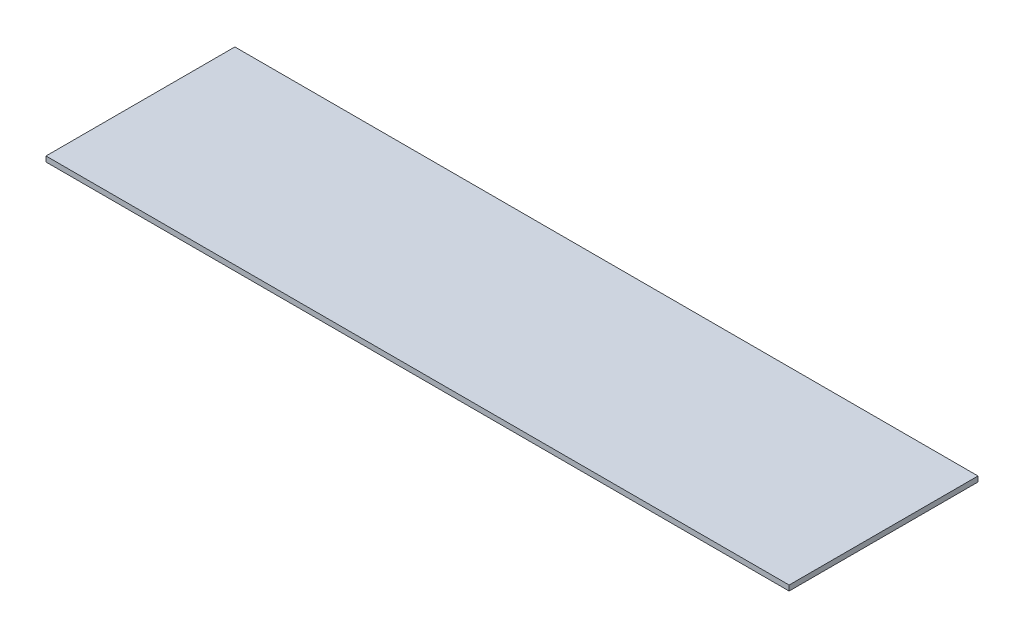
ISO-10303-21;
HEADER;
FILE_DESCRIPTION(('STEP AP214'),'2;1');
FILE_NAME('part.step','',(''),(''),'','','');
FILE_SCHEMA(('AUTOMOTIVE_DESIGN { 1 0 10303 214 1 1 1 1 }'));
ENDSEC;
DATA;
#1=APPLICATION_CONTEXT('core data for automotive mechanical design processes');
#2=APPLICATION_PROTOCOL_DEFINITION('international standard','automotive_design',2000,#1);
#3=PRODUCT_CONTEXT('',#1,'mechanical');
#4=PRODUCT('Part','Part','',(#3));
#5=PRODUCT_RELATED_PRODUCT_CATEGORY('part','',(#4));
#6=PRODUCT_DEFINITION_FORMATION('','',#4);
#7=PRODUCT_DEFINITION_CONTEXT('part definition',#1,'design');
#8=PRODUCT_DEFINITION('design','',#6,#7);
#9=PRODUCT_DEFINITION_SHAPE('','',#8);
#10=(LENGTH_UNIT() NAMED_UNIT(*) SI_UNIT(.MILLI.,.METRE.));
#11=(NAMED_UNIT(*) PLANE_ANGLE_UNIT() SI_UNIT($,.RADIAN.));
#12=(NAMED_UNIT(*) SI_UNIT($,.STERADIAN.) SOLID_ANGLE_UNIT());
#13=UNCERTAINTY_MEASURE_WITH_UNIT(LENGTH_MEASURE(1.E-05),#10,'distance_accuracy_value','');
#14=(GEOMETRIC_REPRESENTATION_CONTEXT(3) GLOBAL_UNCERTAINTY_ASSIGNED_CONTEXT((#13)) GLOBAL_UNIT_ASSIGNED_CONTEXT((#10,
#11,#12)) REPRESENTATION_CONTEXT('',''));
#15=CARTESIAN_POINT('',(0.,0.,0.));
#16=DIRECTION('',(0.,0.,1.));
#17=DIRECTION('',(1.,0.,0.));
#18=AXIS2_PLACEMENT_3D('',#15,#16,#17);
#19=CARTESIAN_POINT('',(-162.5,2.3,41.3));
#20=DIRECTION('',(1.,0.,0.));
#21=DIRECTION('',(0.,0.,-1.));
#22=AXIS2_PLACEMENT_3D('',#19,#20,#21);
#23=PLANE('',#22);
#24=DIRECTION('',(0.,0.,1.));
#25=VECTOR('',#24,1.);
#26=CARTESIAN_POINT('',(-162.5,0.,41.3));
#27=LINE('',#26,#25);
#28=CARTESIAN_POINT('',(-162.5,0.,-41.3));
#29=VERTEX_POINT('',#28);
#30=CARTESIAN_POINT('',(-162.5,0.,41.3));
#31=VERTEX_POINT('',#30);
#32=EDGE_CURVE('E97',#29,#31,#27,.T.);
#33=ORIENTED_EDGE('',*,*,#32,.T.);
#34=DIRECTION('',(0.,-1.,0.));
#35=VECTOR('',#34,1.);
#36=CARTESIAN_POINT('',(-162.5,2.3,41.3));
#37=LINE('',#36,#35);
#38=CARTESIAN_POINT('',(-162.5,2.3,41.3));
#39=VERTEX_POINT('',#38);
#40=EDGE_CURVE('E11',#39,#31,#37,.T.);
#41=ORIENTED_EDGE('',*,*,#40,.F.);
#42=DIRECTION('',(0.,0.,1.));
#43=VECTOR('',#42,1.);
#44=CARTESIAN_POINT('',(-162.5,2.3,41.3));
#45=LINE('',#44,#43);
#46=CARTESIAN_POINT('',(-162.5,2.3,-41.3));
#47=VERTEX_POINT('',#46);
#48=EDGE_CURVE('E85',#47,#39,#45,.T.);
#49=ORIENTED_EDGE('',*,*,#48,.F.);
#50=DIRECTION('',(0.,-1.,0.));
#51=VECTOR('',#50,1.);
#52=CARTESIAN_POINT('',(-162.5,2.3,-41.3));
#53=LINE('',#52,#51);
#54=EDGE_CURVE('E93',#47,#29,#53,.T.);
#55=ORIENTED_EDGE('',*,*,#54,.T.);
#56=EDGE_LOOP('',(#33,#41,#49,#55));
#57=FACE_BOUND('',#56,.T.);
#58=ADVANCED_FACE('F34',(#57),#23,.F.);
#59=CARTESIAN_POINT('',(162.5,2.3,41.3));
#60=DIRECTION('',(0.,0.,-1.));
#61=DIRECTION('',(-1.,0.,0.));
#62=AXIS2_PLACEMENT_3D('',#59,#60,#61);
#63=PLANE('',#62);
#64=DIRECTION('',(1.,0.,0.));
#65=VECTOR('',#64,1.);
#66=CARTESIAN_POINT('',(162.5,0.,41.3));
#67=LINE('',#66,#65);
#68=CARTESIAN_POINT('',(162.5,0.,41.3));
#69=VERTEX_POINT('',#68);
#70=EDGE_CURVE('E89',#31,#69,#67,.T.);
#71=ORIENTED_EDGE('',*,*,#70,.T.);
#72=DIRECTION('',(0.,-1.,0.));
#73=VECTOR('',#72,1.);
#74=CARTESIAN_POINT('',(162.5,2.3,41.3));
#75=LINE('',#74,#73);
#76=CARTESIAN_POINT('',(162.5,2.3,41.3));
#77=VERTEX_POINT('',#76);
#78=EDGE_CURVE('E42',#77,#69,#75,.T.);
#79=ORIENTED_EDGE('',*,*,#78,.F.);
#80=DIRECTION('',(1.,0.,0.));
#81=VECTOR('',#80,1.);
#82=CARTESIAN_POINT('',(162.5,2.3,41.3));
#83=LINE('',#82,#81);
#84=EDGE_CURVE('E80',#39,#77,#83,.T.);
#85=ORIENTED_EDGE('',*,*,#84,.F.);
#86=ORIENTED_EDGE('',*,*,#40,.T.);
#87=EDGE_LOOP('',(#71,#79,#85,#86));
#88=FACE_BOUND('',#87,.T.);
#89=ADVANCED_FACE('F88',(#88),#63,.F.);
#90=CARTESIAN_POINT('',(162.5,2.3,41.3));
#91=DIRECTION('',(-1.,0.,0.));
#92=DIRECTION('',(0.,0.,1.));
#93=AXIS2_PLACEMENT_3D('',#90,#91,#92);
#94=PLANE('',#93);
#95=DIRECTION('',(0.,0.,-1.));
#96=VECTOR('',#95,1.);
#97=CARTESIAN_POINT('',(162.5,0.,41.3));
#98=LINE('',#97,#96);
#99=CARTESIAN_POINT('',(162.5,0.,-41.3));
#100=VERTEX_POINT('',#99);
#101=EDGE_CURVE('E67',#69,#100,#98,.T.);
#102=ORIENTED_EDGE('',*,*,#101,.T.);
#103=DIRECTION('',(0.,-1.,0.));
#104=VECTOR('',#103,1.);
#105=CARTESIAN_POINT('',(162.5,2.3,-41.3));
#106=LINE('',#105,#104);
#107=CARTESIAN_POINT('',(162.5,2.3,-41.3));
#108=VERTEX_POINT('',#107);
#109=EDGE_CURVE('E90',#108,#100,#106,.T.);
#110=ORIENTED_EDGE('',*,*,#109,.F.);
#111=DIRECTION('',(0.,0.,-1.));
#112=VECTOR('',#111,1.);
#113=CARTESIAN_POINT('',(162.5,2.3,41.3));
#114=LINE('',#113,#112);
#115=EDGE_CURVE('E83',#77,#108,#114,.T.);
#116=ORIENTED_EDGE('',*,*,#115,.F.);
#117=ORIENTED_EDGE('',*,*,#78,.T.);
#118=EDGE_LOOP('',(#102,#110,#116,#117));
#119=FACE_BOUND('',#118,.T.);
#120=ADVANCED_FACE('F91',(#119),#94,.F.);
#121=CARTESIAN_POINT('',(162.5,2.3,-41.3));
#122=DIRECTION('',(0.,0.,1.));
#123=DIRECTION('',(1.,0.,0.));
#124=AXIS2_PLACEMENT_3D('',#121,#122,#123);
#125=PLANE('',#124);
#126=DIRECTION('',(-1.,0.,0.));
#127=VECTOR('',#126,1.);
#128=CARTESIAN_POINT('',(162.5,0.,-41.3));
#129=LINE('',#128,#127);
#130=EDGE_CURVE('E73',#100,#29,#129,.T.);
#131=ORIENTED_EDGE('',*,*,#130,.T.);
#132=ORIENTED_EDGE('',*,*,#54,.F.);
#133=DIRECTION('',(-1.,0.,0.));
#134=VECTOR('',#133,1.);
#135=CARTESIAN_POINT('',(162.5,2.3,-41.3));
#136=LINE('',#135,#134);
#137=EDGE_CURVE('E50',#108,#47,#136,.T.);
#138=ORIENTED_EDGE('',*,*,#137,.F.);
#139=ORIENTED_EDGE('',*,*,#109,.T.);
#140=EDGE_LOOP('',(#131,#132,#138,#139));
#141=FACE_BOUND('',#140,.T.);
#142=ADVANCED_FACE('F104',(#141),#125,.F.);
#143=CARTESIAN_POINT('',(0.,2.3,0.));
#144=DIRECTION('',(0.,1.,0.));
#145=DIRECTION('',(0.,0.,1.));
#146=AXIS2_PLACEMENT_3D('',#143,#144,#145);
#147=PLANE('',#146);
#148=ORIENTED_EDGE('',*,*,#48,.T.);
#149=ORIENTED_EDGE('',*,*,#84,.T.);
#150=ORIENTED_EDGE('',*,*,#115,.T.);
#151=ORIENTED_EDGE('',*,*,#137,.T.);
#152=EDGE_LOOP('',(#148,#149,#150,#151));
#153=FACE_BOUND('',#152,.T.);
#154=ADVANCED_FACE('F81',(#153),#147,.T.);
#155=CARTESIAN_POINT('',(0.,0.,0.));
#156=DIRECTION('',(0.,1.,0.));
#157=DIRECTION('',(0.,0.,1.));
#158=AXIS2_PLACEMENT_3D('',#155,#156,#157);
#159=PLANE('',#158);
#160=ORIENTED_EDGE('',*,*,#32,.F.);
#161=ORIENTED_EDGE('',*,*,#130,.F.);
#162=ORIENTED_EDGE('',*,*,#101,.F.);
#163=ORIENTED_EDGE('',*,*,#70,.F.);
#164=EDGE_LOOP('',(#160,#161,#162,#163));
#165=FACE_BOUND('',#164,.T.);
#166=ADVANCED_FACE('F107',(#165),#159,.F.);
#167=CLOSED_SHELL('',(#58,#89,#120,#142,#154,#166));
#168=MANIFOLD_SOLID_BREP('B2',#167);
#169=ADVANCED_BREP_SHAPE_REPRESENTATION('',(#18,#168),#14);
#170=SHAPE_DEFINITION_REPRESENTATION(#9,#169);
ENDSEC;
END-ISO-10303-21;
